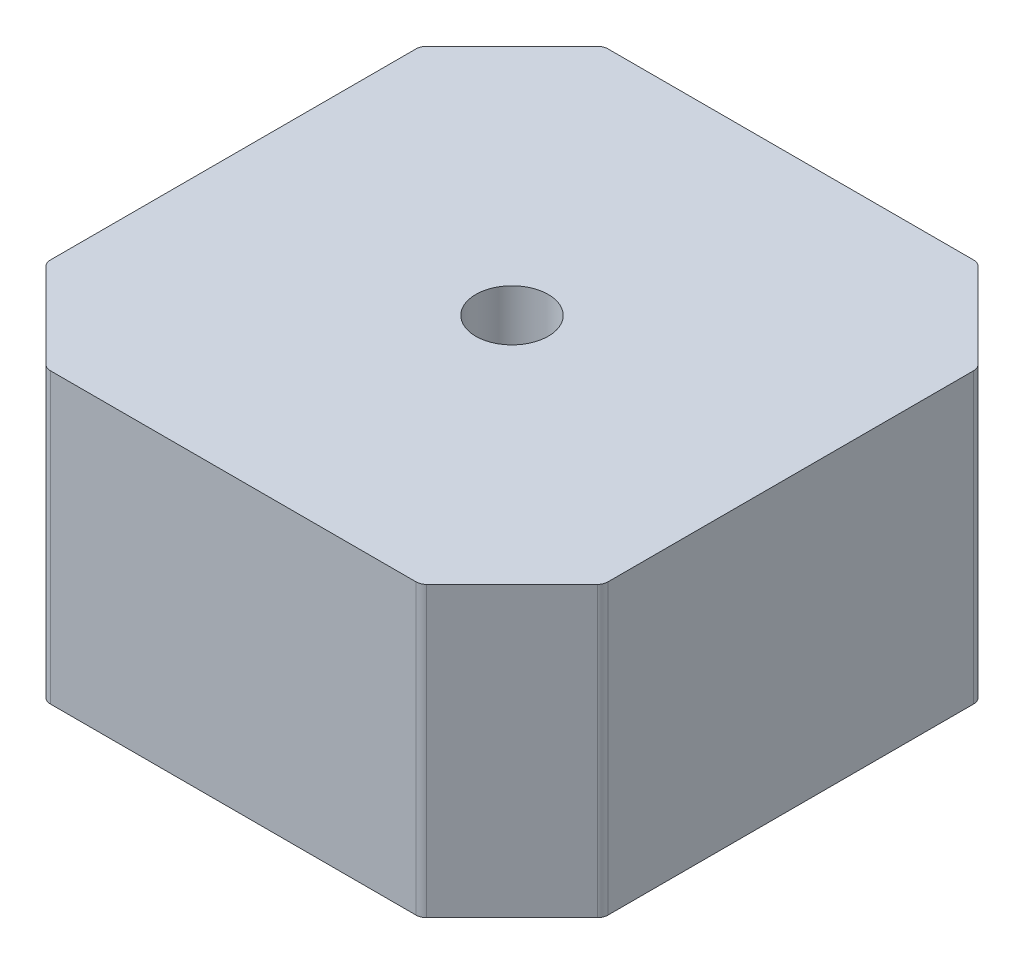
ISO-10303-21;
HEADER;
FILE_DESCRIPTION(('STEP AP214'),'2;1');
FILE_NAME('part.step','',(''),(''),'','','');
FILE_SCHEMA(('AUTOMOTIVE_DESIGN { 1 0 10303 214 1 1 1 1 }'));
ENDSEC;
DATA;
#1=APPLICATION_CONTEXT('core data for automotive mechanical design processes');
#2=APPLICATION_PROTOCOL_DEFINITION('international standard','automotive_design',2000,#1);
#3=PRODUCT_CONTEXT('',#1,'mechanical');
#4=PRODUCT('Part','Part','',(#3));
#5=PRODUCT_RELATED_PRODUCT_CATEGORY('part','',(#4));
#6=PRODUCT_DEFINITION_FORMATION('','',#4);
#7=PRODUCT_DEFINITION_CONTEXT('part definition',#1,'design');
#8=PRODUCT_DEFINITION('design','',#6,#7);
#9=PRODUCT_DEFINITION_SHAPE('','',#8);
#10=(LENGTH_UNIT() NAMED_UNIT(*) SI_UNIT(.MILLI.,.METRE.));
#11=(NAMED_UNIT(*) PLANE_ANGLE_UNIT() SI_UNIT($,.RADIAN.));
#12=(NAMED_UNIT(*) SI_UNIT($,.STERADIAN.) SOLID_ANGLE_UNIT());
#13=UNCERTAINTY_MEASURE_WITH_UNIT(LENGTH_MEASURE(1.E-05),#10,'distance_accuracy_value','');
#14=(GEOMETRIC_REPRESENTATION_CONTEXT(3) GLOBAL_UNCERTAINTY_ASSIGNED_CONTEXT((#13)) GLOBAL_UNIT_ASSIGNED_CONTEXT((#10,
#11,#12)) REPRESENTATION_CONTEXT('',''));
#15=CARTESIAN_POINT('',(0.,0.,0.));
#16=DIRECTION('',(0.,0.,1.));
#17=DIRECTION('',(1.,0.,0.));
#18=AXIS2_PLACEMENT_3D('',#15,#16,#17);
#19=CARTESIAN_POINT('',(21.15,21.9,0.));
#20=DIRECTION('',(1.,0.,0.));
#21=DIRECTION('',(0.,0.,-1.));
#22=AXIS2_PLACEMENT_3D('',#19,#20,#21);
#23=PLANE('',#22);
#24=DIRECTION('',(0.,0.,1.));
#25=VECTOR('',#24,1.);
#26=CARTESIAN_POINT('',(21.15,0.,0.));
#27=LINE('',#26,#25);
#28=CARTESIAN_POINT('',(21.15,0.,-13.8703645217744));
#29=VERTEX_POINT('',#28);
#30=CARTESIAN_POINT('',(21.15,0.,13.8703645217744));
#31=VERTEX_POINT('',#30);
#32=EDGE_CURVE('E196',#29,#31,#27,.T.);
#33=ORIENTED_EDGE('',*,*,#32,.F.);
#34=DIRECTION('',(0.,-1.,0.));
#35=VECTOR('',#34,1.);
#36=CARTESIAN_POINT('',(21.15,21.9,-13.8703645217744));
#37=LINE('',#36,#35);
#38=CARTESIAN_POINT('',(21.15,21.9,-13.8703645217744));
#39=VERTEX_POINT('',#38);
#40=EDGE_CURVE('E11',#39,#29,#37,.T.);
#41=ORIENTED_EDGE('',*,*,#40,.F.);
#42=DIRECTION('',(0.,0.,1.));
#43=VECTOR('',#42,1.);
#44=CARTESIAN_POINT('',(21.15,21.9,0.));
#45=LINE('',#44,#43);
#46=CARTESIAN_POINT('',(21.15,21.9,13.8703645217744));
#47=VERTEX_POINT('',#46);
#48=EDGE_CURVE('E253',#39,#47,#45,.T.);
#49=ORIENTED_EDGE('',*,*,#48,.T.);
#50=DIRECTION('',(0.,-1.,0.));
#51=VECTOR('',#50,1.);
#52=CARTESIAN_POINT('',(21.15,21.9,13.8703645217744));
#53=LINE('',#52,#51);
#54=EDGE_CURVE('E65',#47,#31,#53,.T.);
#55=ORIENTED_EDGE('',*,*,#54,.T.);
#56=EDGE_LOOP('',(#33,#41,#49,#55));
#57=FACE_BOUND('',#56,.T.);
#58=ADVANCED_FACE('F48',(#57),#23,.T.);
#59=CARTESIAN_POINT('',(20.34129992839,21.9,-13.8703645217744));
#60=DIRECTION('',(0.,-1.,0.));
#61=DIRECTION('',(0.,0.,-1.));
#62=AXIS2_PLACEMENT_3D('',#59,#60,#61);
#63=CYLINDRICAL_SURFACE('',#62,0.808700071609974);
#64=CARTESIAN_POINT('',(20.34129992839,0.,-13.8703645217744));
#65=DIRECTION('',(0.,1.,0.));
#66=DIRECTION('',(0.,0.,1.));
#67=AXIS2_PLACEMENT_3D('',#64,#65,#66);
#68=CIRCLE('',#67,0.808700071609974);
#69=CARTESIAN_POINT('',(20.9131372329715,0.,-14.4422018263559));
#70=VERTEX_POINT('',#69);
#71=EDGE_CURVE('E199',#29,#70,#68,.T.);
#72=ORIENTED_EDGE('',*,*,#71,.T.);
#73=DIRECTION('',(0.,-1.,0.));
#74=VECTOR('',#73,1.);
#75=CARTESIAN_POINT('',(20.9131372329715,21.9,-14.4422018263559));
#76=LINE('',#75,#74);
#77=CARTESIAN_POINT('',(20.9131372329715,21.9,-14.4422018263559));
#78=VERTEX_POINT('',#77);
#79=EDGE_CURVE('E57',#78,#70,#76,.T.);
#80=ORIENTED_EDGE('',*,*,#79,.F.);
#81=CARTESIAN_POINT('',(20.34129992839,21.9,-13.8703645217744));
#82=DIRECTION('',(0.,1.,0.));
#83=DIRECTION('',(0.,0.,1.));
#84=AXIS2_PLACEMENT_3D('',#81,#82,#83);
#85=CIRCLE('',#84,0.808700071609974);
#86=EDGE_CURVE('E321',#39,#78,#85,.T.);
#87=ORIENTED_EDGE('',*,*,#86,.F.);
#88=ORIENTED_EDGE('',*,*,#40,.T.);
#89=EDGE_LOOP('',(#72,#80,#87,#88));
#90=FACE_BOUND('',#89,.T.);
#91=ADVANCED_FACE('F371',(#90),#63,.T.);
#92=CARTESIAN_POINT('',(17.6776695296637,21.9,-17.6776695296637));
#93=DIRECTION('',(-0.707106781186548,0.,0.707106781186547));
#94=DIRECTION('',(0.707106781186547,0.,0.707106781186548));
#95=AXIS2_PLACEMENT_3D('',#92,#93,#94);
#96=PLANE('',#95);
#97=DIRECTION('',(-0.707106781186547,0.,-0.707106781186548));
#98=VECTOR('',#97,1.);
#99=CARTESIAN_POINT('',(17.6776695296637,0.,-17.6776695296637));
#100=LINE('',#99,#98);
#101=CARTESIAN_POINT('',(14.4422018263559,0.,-20.9131372329715));
#102=VERTEX_POINT('',#101);
#103=EDGE_CURVE('E203',#70,#102,#100,.T.);
#104=ORIENTED_EDGE('',*,*,#103,.T.);
#105=DIRECTION('',(0.,-1.,0.));
#106=VECTOR('',#105,1.);
#107=CARTESIAN_POINT('',(14.4422018263559,21.9,-20.9131372329715));
#108=LINE('',#107,#106);
#109=CARTESIAN_POINT('',(14.4422018263559,21.9,-20.9131372329715));
#110=VERTEX_POINT('',#109);
#111=EDGE_CURVE('E289',#110,#102,#108,.T.);
#112=ORIENTED_EDGE('',*,*,#111,.F.);
#113=DIRECTION('',(-0.707106781186547,0.,-0.707106781186548));
#114=VECTOR('',#113,1.);
#115=CARTESIAN_POINT('',(17.6776695296637,21.9,-17.6776695296637));
#116=LINE('',#115,#114);
#117=EDGE_CURVE('E299',#78,#110,#116,.T.);
#118=ORIENTED_EDGE('',*,*,#117,.F.);
#119=ORIENTED_EDGE('',*,*,#79,.T.);
#120=EDGE_LOOP('',(#104,#112,#118,#119));
#121=FACE_BOUND('',#120,.T.);
#122=ADVANCED_FACE('F297',(#121),#96,.F.);
#123=CARTESIAN_POINT('',(13.8703645217744,21.9,-20.34129992839));
#124=DIRECTION('',(0.,-1.,0.));
#125=DIRECTION('',(0.,0.,-1.));
#126=AXIS2_PLACEMENT_3D('',#123,#124,#125);
#127=CYLINDRICAL_SURFACE('',#126,0.808700071609971);
#128=CARTESIAN_POINT('',(13.8703645217744,0.,-20.34129992839));
#129=DIRECTION('',(0.,1.,0.));
#130=DIRECTION('',(0.,0.,1.));
#131=AXIS2_PLACEMENT_3D('',#128,#129,#130);
#132=CIRCLE('',#131,0.808700071609971);
#133=CARTESIAN_POINT('',(13.8703645217744,0.,-21.15));
#134=VERTEX_POINT('',#133);
#135=EDGE_CURVE('E207',#134,#102,#132,.F.);
#136=ORIENTED_EDGE('',*,*,#135,.F.);
#137=DIRECTION('',(0.,-1.,0.));
#138=VECTOR('',#137,1.);
#139=CARTESIAN_POINT('',(13.8703645217744,21.9,-21.15));
#140=LINE('',#139,#138);
#141=CARTESIAN_POINT('',(13.8703645217744,21.9,-21.15));
#142=VERTEX_POINT('',#141);
#143=EDGE_CURVE('E286',#142,#134,#140,.T.);
#144=ORIENTED_EDGE('',*,*,#143,.F.);
#145=CARTESIAN_POINT('',(13.8703645217744,21.9,-20.34129992839));
#146=DIRECTION('',(0.,1.,0.));
#147=DIRECTION('',(0.,0.,1.));
#148=AXIS2_PLACEMENT_3D('',#145,#146,#147);
#149=CIRCLE('',#148,0.808700071609971);
#150=EDGE_CURVE('E311',#142,#110,#149,.F.);
#151=ORIENTED_EDGE('',*,*,#150,.T.);
#152=ORIENTED_EDGE('',*,*,#111,.T.);
#153=EDGE_LOOP('',(#136,#144,#151,#152));
#154=FACE_BOUND('',#153,.T.);
#155=ADVANCED_FACE('F308',(#154),#127,.T.);
#156=CARTESIAN_POINT('',(0.,21.9,-21.15));
#157=DIRECTION('',(0.,0.,-1.));
#158=DIRECTION('',(-1.,0.,0.));
#159=AXIS2_PLACEMENT_3D('',#156,#157,#158);
#160=PLANE('',#159);
#161=DIRECTION('',(1.,0.,0.));
#162=VECTOR('',#161,1.);
#163=CARTESIAN_POINT('',(0.,0.,-21.15));
#164=LINE('',#163,#162);
#165=CARTESIAN_POINT('',(-13.8703645217744,0.,-21.15));
#166=VERTEX_POINT('',#165);
#167=EDGE_CURVE('E211',#166,#134,#164,.T.);
#168=ORIENTED_EDGE('',*,*,#167,.F.);
#169=DIRECTION('',(0.,-1.,0.));
#170=VECTOR('',#169,1.);
#171=CARTESIAN_POINT('',(-13.8703645217744,21.9,-21.15));
#172=LINE('',#171,#170);
#173=CARTESIAN_POINT('',(-13.8703645217744,21.9,-21.15));
#174=VERTEX_POINT('',#173);
#175=EDGE_CURVE('E283',#174,#166,#172,.T.);
#176=ORIENTED_EDGE('',*,*,#175,.F.);
#177=DIRECTION('',(1.,0.,0.));
#178=VECTOR('',#177,1.);
#179=CARTESIAN_POINT('',(0.,21.9,-21.15));
#180=LINE('',#179,#178);
#181=EDGE_CURVE('E315',#174,#142,#180,.T.);
#182=ORIENTED_EDGE('',*,*,#181,.T.);
#183=ORIENTED_EDGE('',*,*,#143,.T.);
#184=EDGE_LOOP('',(#168,#176,#182,#183));
#185=FACE_BOUND('',#184,.T.);
#186=ADVANCED_FACE('F500',(#185),#160,.T.);
#187=CARTESIAN_POINT('',(-13.8703645217744,21.9,-20.34129992839));
#188=DIRECTION('',(0.,-1.,0.));
#189=DIRECTION('',(0.,0.,-1.));
#190=AXIS2_PLACEMENT_3D('',#187,#188,#189);
#191=CYLINDRICAL_SURFACE('',#190,0.808700071609971);
#192=CARTESIAN_POINT('',(-13.8703645217744,0.,-20.34129992839));
#193=DIRECTION('',(0.,1.,0.));
#194=DIRECTION('',(0.,0.,1.));
#195=AXIS2_PLACEMENT_3D('',#192,#193,#194);
#196=CIRCLE('',#195,0.808700071609971);
#197=CARTESIAN_POINT('',(-14.4422018263559,0.,-20.9131372329715));
#198=VERTEX_POINT('',#197);
#199=EDGE_CURVE('E215',#166,#198,#196,.T.);
#200=ORIENTED_EDGE('',*,*,#199,.T.);
#201=DIRECTION('',(0.,-1.,0.));
#202=VECTOR('',#201,1.);
#203=CARTESIAN_POINT('',(-14.4422018263559,21.9,-20.9131372329715));
#204=LINE('',#203,#202);
#205=CARTESIAN_POINT('',(-14.4422018263559,21.9,-20.9131372329715));
#206=VERTEX_POINT('',#205);
#207=EDGE_CURVE('E280',#206,#198,#204,.T.);
#208=ORIENTED_EDGE('',*,*,#207,.F.);
#209=CARTESIAN_POINT('',(-13.8703645217744,21.9,-20.34129992839));
#210=DIRECTION('',(0.,1.,0.));
#211=DIRECTION('',(0.,0.,1.));
#212=AXIS2_PLACEMENT_3D('',#209,#210,#211);
#213=CIRCLE('',#212,0.808700071609971);
#214=EDGE_CURVE('E319',#174,#206,#213,.T.);
#215=ORIENTED_EDGE('',*,*,#214,.F.);
#216=ORIENTED_EDGE('',*,*,#175,.T.);
#217=EDGE_LOOP('',(#200,#208,#215,#216));
#218=FACE_BOUND('',#217,.T.);
#219=ADVANCED_FACE('F490',(#218),#191,.T.);
#220=CARTESIAN_POINT('',(-17.6776695296637,21.9,-17.6776695296637));
#221=DIRECTION('',(-0.707106781186548,0.,-0.707106781186547));
#222=DIRECTION('',(-0.707106781186547,0.,0.707106781186548));
#223=AXIS2_PLACEMENT_3D('',#220,#221,#222);
#224=PLANE('',#223);
#225=DIRECTION('',(0.707106781186547,0.,-0.707106781186548));
#226=VECTOR('',#225,1.);
#227=CARTESIAN_POINT('',(-17.6776695296637,0.,-17.6776695296637));
#228=LINE('',#227,#226);
#229=CARTESIAN_POINT('',(-20.9131372329715,0.,-14.4422018263559));
#230=VERTEX_POINT('',#229);
#231=EDGE_CURVE('E219',#230,#198,#228,.T.);
#232=ORIENTED_EDGE('',*,*,#231,.F.);
#233=DIRECTION('',(0.,-1.,0.));
#234=VECTOR('',#233,1.);
#235=CARTESIAN_POINT('',(-20.9131372329715,21.9,-14.4422018263559));
#236=LINE('',#235,#234);
#237=CARTESIAN_POINT('',(-20.9131372329715,21.9,-14.4422018263559));
#238=VERTEX_POINT('',#237);
#239=EDGE_CURVE('E277',#238,#230,#236,.T.);
#240=ORIENTED_EDGE('',*,*,#239,.F.);
#241=DIRECTION('',(0.707106781186547,0.,-0.707106781186548));
#242=VECTOR('',#241,1.);
#243=CARTESIAN_POINT('',(-17.6776695296637,21.9,-17.6776695296637));
#244=LINE('',#243,#242);
#245=EDGE_CURVE('E327',#238,#206,#244,.T.);
#246=ORIENTED_EDGE('',*,*,#245,.T.);
#247=ORIENTED_EDGE('',*,*,#207,.T.);
#248=EDGE_LOOP('',(#232,#240,#246,#247));
#249=FACE_BOUND('',#248,.T.);
#250=ADVANCED_FACE('F480',(#249),#224,.T.);
#251=CARTESIAN_POINT('',(-20.34129992839,21.9,-13.8703645217744));
#252=DIRECTION('',(0.,-1.,0.));
#253=DIRECTION('',(0.,0.,-1.));
#254=AXIS2_PLACEMENT_3D('',#251,#252,#253);
#255=CYLINDRICAL_SURFACE('',#254,0.808700071609974);
#256=CARTESIAN_POINT('',(-20.34129992839,0.,-13.8703645217744));
#257=DIRECTION('',(0.,1.,0.));
#258=DIRECTION('',(0.,0.,1.));
#259=AXIS2_PLACEMENT_3D('',#256,#257,#258);
#260=CIRCLE('',#259,0.808700071609974);
#261=CARTESIAN_POINT('',(-21.15,0.,-13.8703645217744));
#262=VERTEX_POINT('',#261);
#263=EDGE_CURVE('E223',#262,#230,#260,.F.);
#264=ORIENTED_EDGE('',*,*,#263,.F.);
#265=DIRECTION('',(0.,-1.,0.));
#266=VECTOR('',#265,1.);
#267=CARTESIAN_POINT('',(-21.15,21.9,-13.8703645217744));
#268=LINE('',#267,#266);
#269=CARTESIAN_POINT('',(-21.15,21.9,-13.8703645217744));
#270=VERTEX_POINT('',#269);
#271=EDGE_CURVE('E274',#270,#262,#268,.T.);
#272=ORIENTED_EDGE('',*,*,#271,.F.);
#273=CARTESIAN_POINT('',(-20.34129992839,21.9,-13.8703645217744));
#274=DIRECTION('',(0.,1.,0.));
#275=DIRECTION('',(0.,0.,1.));
#276=AXIS2_PLACEMENT_3D('',#273,#274,#275);
#277=CIRCLE('',#276,0.808700071609974);
#278=EDGE_CURVE('E331',#270,#238,#277,.F.);
#279=ORIENTED_EDGE('',*,*,#278,.T.);
#280=ORIENTED_EDGE('',*,*,#239,.T.);
#281=EDGE_LOOP('',(#264,#272,#279,#280));
#282=FACE_BOUND('',#281,.T.);
#283=ADVANCED_FACE('F470',(#282),#255,.T.);
#284=CARTESIAN_POINT('',(-21.15,21.9,0.));
#285=DIRECTION('',(1.,0.,0.));
#286=DIRECTION('',(0.,0.,-1.));
#287=AXIS2_PLACEMENT_3D('',#284,#285,#286);
#288=PLANE('',#287);
#289=DIRECTION('',(0.,0.,1.));
#290=VECTOR('',#289,1.);
#291=CARTESIAN_POINT('',(-21.15,0.,0.));
#292=LINE('',#291,#290);
#293=CARTESIAN_POINT('',(-21.15,0.,13.8703645217744));
#294=VERTEX_POINT('',#293);
#295=EDGE_CURVE('E227',#262,#294,#292,.T.);
#296=ORIENTED_EDGE('',*,*,#295,.T.);
#297=DIRECTION('',(0.,-1.,0.));
#298=VECTOR('',#297,1.);
#299=CARTESIAN_POINT('',(-21.15,21.9,13.8703645217744));
#300=LINE('',#299,#298);
#301=CARTESIAN_POINT('',(-21.15,21.9,13.8703645217744));
#302=VERTEX_POINT('',#301);
#303=EDGE_CURVE('E270',#302,#294,#300,.T.);
#304=ORIENTED_EDGE('',*,*,#303,.F.);
#305=DIRECTION('',(0.,0.,1.));
#306=VECTOR('',#305,1.);
#307=CARTESIAN_POINT('',(-21.15,21.9,0.));
#308=LINE('',#307,#306);
#309=EDGE_CURVE('E335',#270,#302,#308,.T.);
#310=ORIENTED_EDGE('',*,*,#309,.F.);
#311=ORIENTED_EDGE('',*,*,#271,.T.);
#312=EDGE_LOOP('',(#296,#304,#310,#311));
#313=FACE_BOUND('',#312,.T.);
#314=ADVANCED_FACE('F459',(#313),#288,.F.);
#315=CARTESIAN_POINT('',(-20.34129992839,21.9,13.8703645217744));
#316=DIRECTION('',(0.,-1.,0.));
#317=DIRECTION('',(0.,0.,-1.));
#318=AXIS2_PLACEMENT_3D('',#315,#316,#317);
#319=CYLINDRICAL_SURFACE('',#318,0.808700071609974);
#320=CARTESIAN_POINT('',(-20.34129992839,0.,13.8703645217744));
#321=DIRECTION('',(0.,1.,0.));
#322=DIRECTION('',(0.,0.,1.));
#323=AXIS2_PLACEMENT_3D('',#320,#321,#322);
#324=CIRCLE('',#323,0.808700071609974);
#325=CARTESIAN_POINT('',(-20.9131372329715,0.,14.4422018263559));
#326=VERTEX_POINT('',#325);
#327=EDGE_CURVE('E230',#294,#326,#324,.T.);
#328=ORIENTED_EDGE('',*,*,#327,.T.);
#329=DIRECTION('',(0.,-1.,0.));
#330=VECTOR('',#329,1.);
#331=CARTESIAN_POINT('',(-20.9131372329715,21.9,14.4422018263559));
#332=LINE('',#331,#330);
#333=CARTESIAN_POINT('',(-20.9131372329715,21.9,14.4422018263559));
#334=VERTEX_POINT('',#333);
#335=EDGE_CURVE('E266',#334,#326,#332,.T.);
#336=ORIENTED_EDGE('',*,*,#335,.F.);
#337=CARTESIAN_POINT('',(-20.34129992839,21.9,13.8703645217744));
#338=DIRECTION('',(0.,1.,0.));
#339=DIRECTION('',(0.,0.,1.));
#340=AXIS2_PLACEMENT_3D('',#337,#338,#339);
#341=CIRCLE('',#340,0.808700071609974);
#342=EDGE_CURVE('E338',#302,#334,#341,.T.);
#343=ORIENTED_EDGE('',*,*,#342,.F.);
#344=ORIENTED_EDGE('',*,*,#303,.T.);
#345=EDGE_LOOP('',(#328,#336,#343,#344));
#346=FACE_BOUND('',#345,.T.);
#347=ADVANCED_FACE('F450',(#346),#319,.T.);
#348=CARTESIAN_POINT('',(-17.6776695296637,21.9,17.6776695296637));
#349=DIRECTION('',(0.707106781186548,0.,-0.707106781186547));
#350=DIRECTION('',(-0.707106781186547,0.,-0.707106781186548));
#351=AXIS2_PLACEMENT_3D('',#348,#349,#350);
#352=PLANE('',#351);
#353=DIRECTION('',(0.707106781186547,0.,0.707106781186548));
#354=VECTOR('',#353,1.);
#355=CARTESIAN_POINT('',(-17.6776695296637,0.,17.6776695296637));
#356=LINE('',#355,#354);
#357=CARTESIAN_POINT('',(-14.4422018263559,0.,20.9131372329715));
#358=VERTEX_POINT('',#357);
#359=EDGE_CURVE('E233',#326,#358,#356,.T.);
#360=ORIENTED_EDGE('',*,*,#359,.T.);
#361=DIRECTION('',(0.,-1.,0.));
#362=VECTOR('',#361,1.);
#363=CARTESIAN_POINT('',(-14.4422018263559,21.9,20.9131372329715));
#364=LINE('',#363,#362);
#365=CARTESIAN_POINT('',(-14.4422018263559,21.9,20.9131372329715));
#366=VERTEX_POINT('',#365);
#367=EDGE_CURVE('E263',#366,#358,#364,.T.);
#368=ORIENTED_EDGE('',*,*,#367,.F.);
#369=DIRECTION('',(0.707106781186547,0.,0.707106781186548));
#370=VECTOR('',#369,1.);
#371=CARTESIAN_POINT('',(-17.6776695296637,21.9,17.6776695296637));
#372=LINE('',#371,#370);
#373=EDGE_CURVE('E341',#334,#366,#372,.T.);
#374=ORIENTED_EDGE('',*,*,#373,.F.);
#375=ORIENTED_EDGE('',*,*,#335,.T.);
#376=EDGE_LOOP('',(#360,#368,#374,#375));
#377=FACE_BOUND('',#376,.T.);
#378=ADVANCED_FACE('F356',(#377),#352,.F.);
#379=CARTESIAN_POINT('',(-13.8703645217744,21.9,20.34129992839));
#380=DIRECTION('',(0.,-1.,0.));
#381=DIRECTION('',(0.,0.,-1.));
#382=AXIS2_PLACEMENT_3D('',#379,#380,#381);
#383=CYLINDRICAL_SURFACE('',#382,0.808700071609971);
#384=CARTESIAN_POINT('',(-13.8703645217744,0.,20.34129992839));
#385=DIRECTION('',(0.,1.,0.));
#386=DIRECTION('',(0.,0.,1.));
#387=AXIS2_PLACEMENT_3D('',#384,#385,#386);
#388=CIRCLE('',#387,0.808700071609971);
#389=CARTESIAN_POINT('',(-13.8703645217744,0.,21.15));
#390=VERTEX_POINT('',#389);
#391=EDGE_CURVE('E237',#390,#358,#388,.F.);
#392=ORIENTED_EDGE('',*,*,#391,.F.);
#393=DIRECTION('',(0.,-1.,0.));
#394=VECTOR('',#393,1.);
#395=CARTESIAN_POINT('',(-13.8703645217744,21.9,21.15));
#396=LINE('',#395,#394);
#397=CARTESIAN_POINT('',(-13.8703645217744,21.9,21.15));
#398=VERTEX_POINT('',#397);
#399=EDGE_CURVE('E260',#398,#390,#396,.T.);
#400=ORIENTED_EDGE('',*,*,#399,.F.);
#401=CARTESIAN_POINT('',(-13.8703645217744,21.9,20.34129992839));
#402=DIRECTION('',(0.,1.,0.));
#403=DIRECTION('',(0.,0.,1.));
#404=AXIS2_PLACEMENT_3D('',#401,#402,#403);
#405=CIRCLE('',#404,0.808700071609971);
#406=EDGE_CURVE('E344',#398,#366,#405,.F.);
#407=ORIENTED_EDGE('',*,*,#406,.T.);
#408=ORIENTED_EDGE('',*,*,#367,.T.);
#409=EDGE_LOOP('',(#392,#400,#407,#408));
#410=FACE_BOUND('',#409,.T.);
#411=ADVANCED_FACE('F350',(#410),#383,.T.);
#412=CARTESIAN_POINT('',(0.,21.9,21.15));
#413=DIRECTION('',(0.,0.,-1.));
#414=DIRECTION('',(-1.,0.,0.));
#415=AXIS2_PLACEMENT_3D('',#412,#413,#414);
#416=PLANE('',#415);
#417=DIRECTION('',(1.,0.,0.));
#418=VECTOR('',#417,1.);
#419=CARTESIAN_POINT('',(0.,0.,21.15));
#420=LINE('',#419,#418);
#421=CARTESIAN_POINT('',(13.8703645217744,0.,21.15));
#422=VERTEX_POINT('',#421);
#423=EDGE_CURVE('E241',#390,#422,#420,.T.);
#424=ORIENTED_EDGE('',*,*,#423,.T.);
#425=DIRECTION('',(0.,-1.,0.));
#426=VECTOR('',#425,1.);
#427=CARTESIAN_POINT('',(13.8703645217744,21.9,21.15));
#428=LINE('',#427,#426);
#429=CARTESIAN_POINT('',(13.8703645217744,21.9,21.15));
#430=VERTEX_POINT('',#429);
#431=EDGE_CURVE('E186',#430,#422,#428,.T.);
#432=ORIENTED_EDGE('',*,*,#431,.F.);
#433=DIRECTION('',(1.,0.,0.));
#434=VECTOR('',#433,1.);
#435=CARTESIAN_POINT('',(0.,21.9,21.15));
#436=LINE('',#435,#434);
#437=EDGE_CURVE('E172',#398,#430,#436,.T.);
#438=ORIENTED_EDGE('',*,*,#437,.F.);
#439=ORIENTED_EDGE('',*,*,#399,.T.);
#440=EDGE_LOOP('',(#424,#432,#438,#439));
#441=FACE_BOUND('',#440,.T.);
#442=ADVANCED_FACE('F361',(#441),#416,.F.);
#443=CARTESIAN_POINT('',(13.8703645217744,21.9,20.34129992839));
#444=DIRECTION('',(0.,-1.,0.));
#445=DIRECTION('',(0.,0.,-1.));
#446=AXIS2_PLACEMENT_3D('',#443,#444,#445);
#447=CYLINDRICAL_SURFACE('',#446,0.808700071609971);
#448=CARTESIAN_POINT('',(13.8703645217744,0.,20.34129992839));
#449=DIRECTION('',(0.,1.,0.));
#450=DIRECTION('',(0.,0.,1.));
#451=AXIS2_PLACEMENT_3D('',#448,#449,#450);
#452=CIRCLE('',#451,0.808700071609971);
#453=CARTESIAN_POINT('',(14.4422018263559,0.,20.9131372329715));
#454=VERTEX_POINT('',#453);
#455=EDGE_CURVE('E182',#422,#454,#452,.T.);
#456=ORIENTED_EDGE('',*,*,#455,.T.);
#457=DIRECTION('',(0.,-1.,0.));
#458=VECTOR('',#457,1.);
#459=CARTESIAN_POINT('',(14.4422018263559,21.9,20.9131372329715));
#460=LINE('',#459,#458);
#461=CARTESIAN_POINT('',(14.4422018263559,21.9,20.9131372329715));
#462=VERTEX_POINT('',#461);
#463=EDGE_CURVE('E179',#462,#454,#460,.T.);
#464=ORIENTED_EDGE('',*,*,#463,.F.);
#465=CARTESIAN_POINT('',(13.8703645217744,21.9,20.34129992839));
#466=DIRECTION('',(0.,1.,0.));
#467=DIRECTION('',(0.,0.,1.));
#468=AXIS2_PLACEMENT_3D('',#465,#466,#467);
#469=CIRCLE('',#468,0.808700071609971);
#470=EDGE_CURVE('E163',#430,#462,#469,.T.);
#471=ORIENTED_EDGE('',*,*,#470,.F.);
#472=ORIENTED_EDGE('',*,*,#431,.T.);
#473=EDGE_LOOP('',(#456,#464,#471,#472));
#474=FACE_BOUND('',#473,.T.);
#475=ADVANCED_FACE('F180',(#474),#447,.T.);
#476=CARTESIAN_POINT('',(17.6776695296637,21.9,17.6776695296637));
#477=DIRECTION('',(0.707106781186548,0.,0.707106781186547));
#478=DIRECTION('',(0.707106781186547,0.,-0.707106781186548));
#479=AXIS2_PLACEMENT_3D('',#476,#477,#478);
#480=PLANE('',#479);
#481=DIRECTION('',(-0.707106781186547,0.,0.707106781186548));
#482=VECTOR('',#481,1.);
#483=CARTESIAN_POINT('',(17.6776695296637,0.,17.6776695296637));
#484=LINE('',#483,#482);
#485=CARTESIAN_POINT('',(20.9131372329715,0.,14.4422018263559));
#486=VERTEX_POINT('',#485);
#487=EDGE_CURVE('E246',#486,#454,#484,.T.);
#488=ORIENTED_EDGE('',*,*,#487,.F.);
#489=DIRECTION('',(0.,-1.,0.));
#490=VECTOR('',#489,1.);
#491=CARTESIAN_POINT('',(20.9131372329715,21.9,14.4422018263559));
#492=LINE('',#491,#490);
#493=CARTESIAN_POINT('',(20.9131372329715,21.9,14.4422018263559));
#494=VERTEX_POINT('',#493);
#495=EDGE_CURVE('E114',#494,#486,#492,.T.);
#496=ORIENTED_EDGE('',*,*,#495,.F.);
#497=DIRECTION('',(-0.707106781186547,0.,0.707106781186548));
#498=VECTOR('',#497,1.);
#499=CARTESIAN_POINT('',(17.6776695296637,21.9,17.6776695296637));
#500=LINE('',#499,#498);
#501=EDGE_CURVE('E169',#494,#462,#500,.T.);
#502=ORIENTED_EDGE('',*,*,#501,.T.);
#503=ORIENTED_EDGE('',*,*,#463,.T.);
#504=EDGE_LOOP('',(#488,#496,#502,#503));
#505=FACE_BOUND('',#504,.T.);
#506=ADVANCED_FACE('F188',(#505),#480,.T.);
#507=CARTESIAN_POINT('',(20.34129992839,21.9,13.8703645217744));
#508=DIRECTION('',(0.,-1.,0.));
#509=DIRECTION('',(0.,0.,-1.));
#510=AXIS2_PLACEMENT_3D('',#507,#508,#509);
#511=CYLINDRICAL_SURFACE('',#510,0.808700071609974);
#512=CARTESIAN_POINT('',(20.34129992839,0.,13.8703645217744));
#513=DIRECTION('',(0.,1.,0.));
#514=DIRECTION('',(0.,0.,1.));
#515=AXIS2_PLACEMENT_3D('',#512,#513,#514);
#516=CIRCLE('',#515,0.808700071609974);
#517=EDGE_CURVE('E249',#31,#486,#516,.F.);
#518=ORIENTED_EDGE('',*,*,#517,.F.);
#519=ORIENTED_EDGE('',*,*,#54,.F.);
#520=CARTESIAN_POINT('',(20.34129992839,21.9,13.8703645217744));
#521=DIRECTION('',(0.,1.,0.));
#522=DIRECTION('',(0.,0.,1.));
#523=AXIS2_PLACEMENT_3D('',#520,#521,#522);
#524=CIRCLE('',#523,0.808700071609974);
#525=EDGE_CURVE('E190',#47,#494,#524,.F.);
#526=ORIENTED_EDGE('',*,*,#525,.T.);
#527=ORIENTED_EDGE('',*,*,#495,.T.);
#528=EDGE_LOOP('',(#518,#519,#526,#527));
#529=FACE_BOUND('',#528,.T.);
#530=ADVANCED_FACE('F375',(#529),#511,.T.);
#531=CARTESIAN_POINT('',(0.,21.9,0.));
#532=DIRECTION('',(0.,1.,0.));
#533=DIRECTION('',(0.,0.,1.));
#534=AXIS2_PLACEMENT_3D('',#531,#532,#533);
#535=PLANE('',#534);
#536=CARTESIAN_POINT('',(0.,21.9,0.));
#537=DIRECTION('',(0.,1.,0.));
#538=DIRECTION('',(0.,0.,1.));
#539=AXIS2_PLACEMENT_3D('',#536,#537,#538);
#540=CIRCLE('',#539,2.75);
#541=CARTESIAN_POINT('',(0.,21.9,2.75));
#542=VERTEX_POINT('',#541);
#543=EDGE_CURVE('E200',#542,#542,#540,.T.);
#544=ORIENTED_EDGE('',*,*,#543,.F.);
#545=EDGE_LOOP('',(#544));
#546=FACE_BOUND('',#545,.T.);
#547=ORIENTED_EDGE('',*,*,#48,.F.);
#548=ORIENTED_EDGE('',*,*,#86,.T.);
#549=ORIENTED_EDGE('',*,*,#117,.T.);
#550=ORIENTED_EDGE('',*,*,#150,.F.);
#551=ORIENTED_EDGE('',*,*,#181,.F.);
#552=ORIENTED_EDGE('',*,*,#214,.T.);
#553=ORIENTED_EDGE('',*,*,#245,.F.);
#554=ORIENTED_EDGE('',*,*,#278,.F.);
#555=ORIENTED_EDGE('',*,*,#309,.T.);
#556=ORIENTED_EDGE('',*,*,#342,.T.);
#557=ORIENTED_EDGE('',*,*,#373,.T.);
#558=ORIENTED_EDGE('',*,*,#406,.F.);
#559=ORIENTED_EDGE('',*,*,#437,.T.);
#560=ORIENTED_EDGE('',*,*,#470,.T.);
#561=ORIENTED_EDGE('',*,*,#501,.F.);
#562=ORIENTED_EDGE('',*,*,#525,.F.);
#563=EDGE_LOOP('',(#547,#548,#549,#550,#551,#552,#553,#554,#555,#556,#557,#558,#559,#560,#561,#562));
#564=FACE_BOUND('',#563,.T.);
#565=ADVANCED_FACE('F166',(#546,#564),#535,.T.);
#566=CARTESIAN_POINT('',(0.,0.,0.));
#567=DIRECTION('',(0.,1.,0.));
#568=DIRECTION('',(0.,0.,1.));
#569=AXIS2_PLACEMENT_3D('',#566,#567,#568);
#570=PLANE('',#569);
#571=CARTESIAN_POINT('',(0.,0.,0.));
#572=DIRECTION('',(0.,1.,0.));
#573=DIRECTION('',(0.,0.,1.));
#574=AXIS2_PLACEMENT_3D('',#571,#572,#573);
#575=CIRCLE('',#574,2.75);
#576=CARTESIAN_POINT('',(0.,0.,2.75));
#577=VERTEX_POINT('',#576);
#578=EDGE_CURVE('E399',#577,#577,#575,.T.);
#579=ORIENTED_EDGE('',*,*,#578,.T.);
#580=EDGE_LOOP('',(#579));
#581=FACE_BOUND('',#580,.T.);
#582=ORIENTED_EDGE('',*,*,#32,.T.);
#583=ORIENTED_EDGE('',*,*,#517,.T.);
#584=ORIENTED_EDGE('',*,*,#487,.T.);
#585=ORIENTED_EDGE('',*,*,#455,.F.);
#586=ORIENTED_EDGE('',*,*,#423,.F.);
#587=ORIENTED_EDGE('',*,*,#391,.T.);
#588=ORIENTED_EDGE('',*,*,#359,.F.);
#589=ORIENTED_EDGE('',*,*,#327,.F.);
#590=ORIENTED_EDGE('',*,*,#295,.F.);
#591=ORIENTED_EDGE('',*,*,#263,.T.);
#592=ORIENTED_EDGE('',*,*,#231,.T.);
#593=ORIENTED_EDGE('',*,*,#199,.F.);
#594=ORIENTED_EDGE('',*,*,#167,.T.);
#595=ORIENTED_EDGE('',*,*,#135,.T.);
#596=ORIENTED_EDGE('',*,*,#103,.F.);
#597=ORIENTED_EDGE('',*,*,#71,.F.);
#598=EDGE_LOOP('',(#582,#583,#584,#585,#586,#587,#588,#589,#590,#591,#592,#593,#594,#595,#596,#597));
#599=FACE_BOUND('',#598,.T.);
#600=ADVANCED_FACE('F303',(#581,#599),#570,.F.);
#601=CARTESIAN_POINT('',(0.,0.,0.));
#602=DIRECTION('',(0.,1.,0.));
#603=DIRECTION('',(0.,0.,1.));
#604=AXIS2_PLACEMENT_3D('',#601,#602,#603);
#605=CYLINDRICAL_SURFACE('',#604,2.75);
#606=ORIENTED_EDGE('',*,*,#543,.T.);
#607=EDGE_LOOP('',(#606));
#608=FACE_BOUND('',#607,.T.);
#609=ORIENTED_EDGE('',*,*,#578,.F.);
#610=EDGE_LOOP('',(#609));
#611=FACE_BOUND('',#610,.T.);
#612=ADVANCED_FACE('F387',(#608,#611),#605,.F.);
#613=CLOSED_SHELL('',(#58,#91,#122,#155,#186,#219,#250,#283,#314,#347,#378,#411,#442,#475,#506,
#530,#565,#600,#612));
#614=MANIFOLD_SOLID_BREP('B2',#613);
#615=ADVANCED_BREP_SHAPE_REPRESENTATION('',(#18,#614),#14);
#616=SHAPE_DEFINITION_REPRESENTATION(#9,#615);
ENDSEC;
END-ISO-10303-21;
